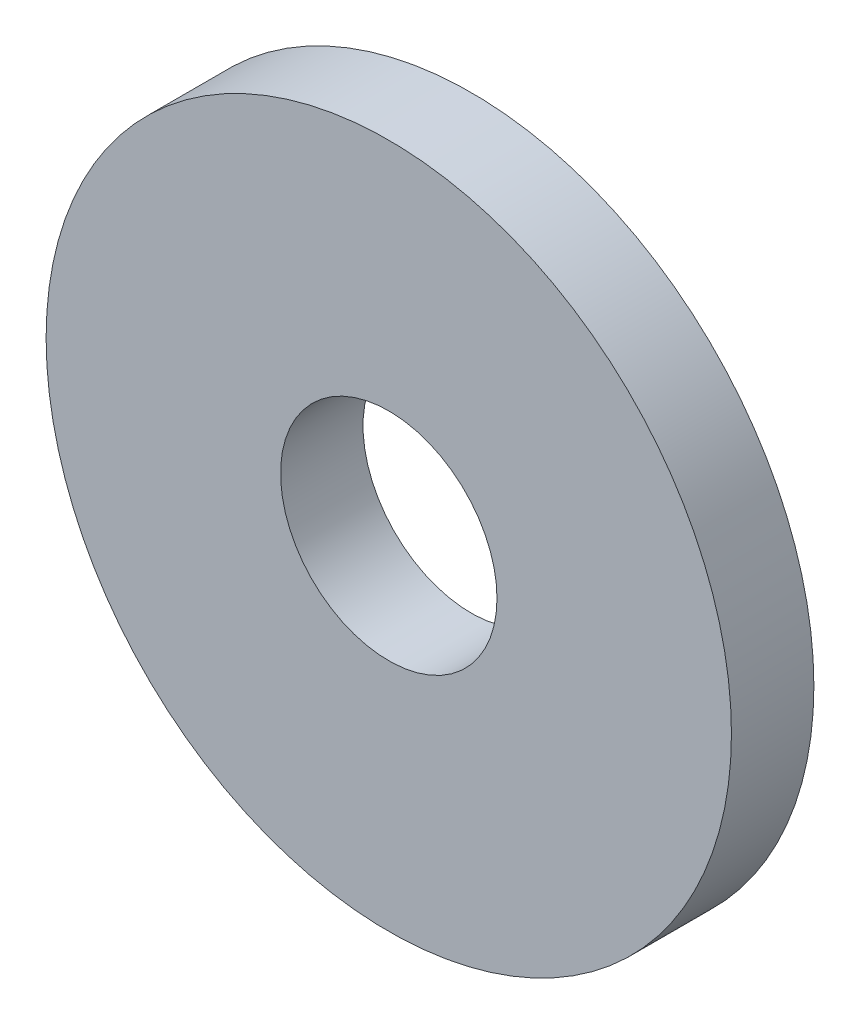
ISO-10303-21;
HEADER;
FILE_DESCRIPTION(('STEP AP214'),'2;1');
FILE_NAME('part.step','',(''),(''),'','','');
FILE_SCHEMA(('AUTOMOTIVE_DESIGN { 1 0 10303 214 1 1 1 1 }'));
ENDSEC;
DATA;
#1=APPLICATION_CONTEXT('core data for automotive mechanical design processes');
#2=APPLICATION_PROTOCOL_DEFINITION('international standard','automotive_design',2000,#1);
#3=PRODUCT_CONTEXT('',#1,'mechanical');
#4=PRODUCT('Part','Part','',(#3));
#5=PRODUCT_RELATED_PRODUCT_CATEGORY('part','',(#4));
#6=PRODUCT_DEFINITION_FORMATION('','',#4);
#7=PRODUCT_DEFINITION_CONTEXT('part definition',#1,'design');
#8=PRODUCT_DEFINITION('design','',#6,#7);
#9=PRODUCT_DEFINITION_SHAPE('','',#8);
#10=(LENGTH_UNIT() NAMED_UNIT(*) SI_UNIT(.MILLI.,.METRE.));
#11=(NAMED_UNIT(*) PLANE_ANGLE_UNIT() SI_UNIT($,.RADIAN.));
#12=(NAMED_UNIT(*) SI_UNIT($,.STERADIAN.) SOLID_ANGLE_UNIT());
#13=UNCERTAINTY_MEASURE_WITH_UNIT(LENGTH_MEASURE(1.E-05),#10,'distance_accuracy_value','');
#14=(GEOMETRIC_REPRESENTATION_CONTEXT(3) GLOBAL_UNCERTAINTY_ASSIGNED_CONTEXT((#13)) GLOBAL_UNIT_ASSIGNED_CONTEXT((#10,
#11,#12)) REPRESENTATION_CONTEXT('',''));
#15=CARTESIAN_POINT('',(0.,0.,0.));
#16=DIRECTION('',(0.,0.,1.));
#17=DIRECTION('',(1.,0.,0.));
#18=AXIS2_PLACEMENT_3D('',#15,#16,#17);
#19=CARTESIAN_POINT('',(0.,0.,1.6));
#20=DIRECTION('',(0.,0.,1.));
#21=DIRECTION('',(1.,0.,0.));
#22=AXIS2_PLACEMENT_3D('',#19,#20,#21);
#23=PLANE('',#22);
#24=CARTESIAN_POINT('',(0.,0.,1.6));
#25=DIRECTION('',(0.,0.,1.));
#26=DIRECTION('',(1.,0.,0.));
#27=AXIS2_PLACEMENT_3D('',#24,#25,#26);
#28=CIRCLE('',#27,6.65);
#29=CARTESIAN_POINT('',(6.65,0.,1.6));
#30=VERTEX_POINT('',#29);
#31=EDGE_CURVE('E9',#30,#30,#28,.T.);
#32=ORIENTED_EDGE('',*,*,#31,.T.);
#33=EDGE_LOOP('',(#32));
#34=FACE_BOUND('',#33,.T.);
#35=CARTESIAN_POINT('',(0.,0.,1.6));
#36=DIRECTION('',(0.,0.,1.));
#37=DIRECTION('',(1.,0.,0.));
#38=AXIS2_PLACEMENT_3D('',#35,#36,#37);
#39=CIRCLE('',#38,2.1);
#40=CARTESIAN_POINT('',(2.1,0.,1.6));
#41=VERTEX_POINT('',#40);
#42=EDGE_CURVE('E25',#41,#41,#39,.T.);
#43=ORIENTED_EDGE('',*,*,#42,.F.);
#44=EDGE_LOOP('',(#43));
#45=FACE_BOUND('',#44,.T.);
#46=ADVANCED_FACE('F14',(#34,#45),#23,.T.);
#47=CARTESIAN_POINT('',(0.,0.,0.));
#48=DIRECTION('',(0.,0.,1.));
#49=DIRECTION('',(1.,0.,0.));
#50=AXIS2_PLACEMENT_3D('',#47,#48,#49);
#51=PLANE('',#50);
#52=CARTESIAN_POINT('',(0.,0.,0.));
#53=DIRECTION('',(0.,0.,1.));
#54=DIRECTION('',(1.,0.,0.));
#55=AXIS2_PLACEMENT_3D('',#52,#53,#54);
#56=CIRCLE('',#55,6.65);
#57=CARTESIAN_POINT('',(6.65,0.,0.));
#58=VERTEX_POINT('',#57);
#59=EDGE_CURVE('E18',#58,#58,#56,.T.);
#60=ORIENTED_EDGE('',*,*,#59,.F.);
#61=EDGE_LOOP('',(#60));
#62=FACE_BOUND('',#61,.T.);
#63=CARTESIAN_POINT('',(0.,0.,0.));
#64=DIRECTION('',(0.,0.,1.));
#65=DIRECTION('',(1.,0.,0.));
#66=AXIS2_PLACEMENT_3D('',#63,#64,#65);
#67=CIRCLE('',#66,2.1);
#68=CARTESIAN_POINT('',(2.1,0.,0.));
#69=VERTEX_POINT('',#68);
#70=EDGE_CURVE('E27',#69,#69,#67,.T.);
#71=ORIENTED_EDGE('',*,*,#70,.T.);
#72=EDGE_LOOP('',(#71));
#73=FACE_BOUND('',#72,.T.);
#74=ADVANCED_FACE('F37',(#62,#73),#51,.F.);
#75=CARTESIAN_POINT('',(0.,0.,1.6));
#76=DIRECTION('',(0.,0.,-1.));
#77=DIRECTION('',(-1.,0.,0.));
#78=AXIS2_PLACEMENT_3D('',#75,#76,#77);
#79=CYLINDRICAL_SURFACE('',#78,6.65);
#80=ORIENTED_EDGE('',*,*,#31,.F.);
#81=EDGE_LOOP('',(#80));
#82=FACE_BOUND('',#81,.T.);
#83=ORIENTED_EDGE('',*,*,#59,.T.);
#84=EDGE_LOOP('',(#83));
#85=FACE_BOUND('',#84,.T.);
#86=ADVANCED_FACE('F16',(#82,#85),#79,.T.);
#87=CARTESIAN_POINT('',(0.,0.,1.6));
#88=DIRECTION('',(0.,0.,-1.));
#89=DIRECTION('',(-1.,0.,0.));
#90=AXIS2_PLACEMENT_3D('',#87,#88,#89);
#91=CYLINDRICAL_SURFACE('',#90,2.1);
#92=ORIENTED_EDGE('',*,*,#42,.T.);
#93=EDGE_LOOP('',(#92));
#94=FACE_BOUND('',#93,.T.);
#95=ORIENTED_EDGE('',*,*,#70,.F.);
#96=EDGE_LOOP('',(#95));
#97=FACE_BOUND('',#96,.T.);
#98=ADVANCED_FACE('F33',(#94,#97),#91,.F.);
#99=CLOSED_SHELL('',(#46,#74,#86,#98));
#100=MANIFOLD_SOLID_BREP('B1',#99);
#101=ADVANCED_BREP_SHAPE_REPRESENTATION('',(#18,#100),#14);
#102=SHAPE_DEFINITION_REPRESENTATION(#9,#101);
ENDSEC;
END-ISO-10303-21;
